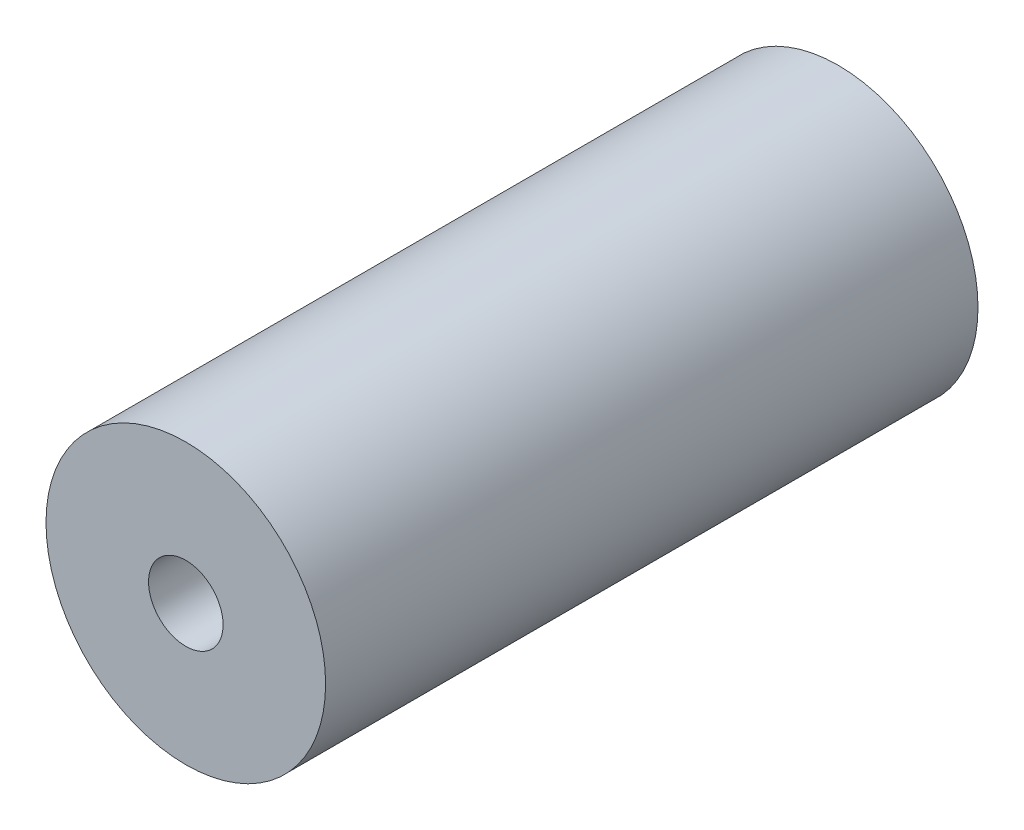
ISO-10303-21;
HEADER;
FILE_DESCRIPTION(('STEP AP214'),'2;1');
FILE_NAME('part.step','',(''),(''),'','','');
FILE_SCHEMA(('AUTOMOTIVE_DESIGN { 1 0 10303 214 1 1 1 1 }'));
ENDSEC;
DATA;
#1=APPLICATION_CONTEXT('core data for automotive mechanical design processes');
#2=APPLICATION_PROTOCOL_DEFINITION('international standard','automotive_design',2000,#1);
#3=PRODUCT_CONTEXT('',#1,'mechanical');
#4=PRODUCT('Part','Part','',(#3));
#5=PRODUCT_RELATED_PRODUCT_CATEGORY('part','',(#4));
#6=PRODUCT_DEFINITION_FORMATION('','',#4);
#7=PRODUCT_DEFINITION_CONTEXT('part definition',#1,'design');
#8=PRODUCT_DEFINITION('design','',#6,#7);
#9=PRODUCT_DEFINITION_SHAPE('','',#8);
#10=(LENGTH_UNIT() NAMED_UNIT(*) SI_UNIT(.MILLI.,.METRE.));
#11=(NAMED_UNIT(*) PLANE_ANGLE_UNIT() SI_UNIT($,.RADIAN.));
#12=(NAMED_UNIT(*) SI_UNIT($,.STERADIAN.) SOLID_ANGLE_UNIT());
#13=UNCERTAINTY_MEASURE_WITH_UNIT(LENGTH_MEASURE(1.E-05),#10,'distance_accuracy_value','');
#14=(GEOMETRIC_REPRESENTATION_CONTEXT(3) GLOBAL_UNCERTAINTY_ASSIGNED_CONTEXT((#13)) GLOBAL_UNIT_ASSIGNED_CONTEXT((#10,
#11,#12)) REPRESENTATION_CONTEXT('',''));
#15=CARTESIAN_POINT('',(0.,0.,0.));
#16=DIRECTION('',(0.,0.,1.));
#17=DIRECTION('',(1.,0.,0.));
#18=AXIS2_PLACEMENT_3D('',#15,#16,#17);
#19=CARTESIAN_POINT('',(0.,0.,14.));
#20=DIRECTION('',(0.,0.,1.));
#21=DIRECTION('',(1.,0.,0.));
#22=AXIS2_PLACEMENT_3D('',#19,#20,#21);
#23=PLANE('',#22);
#24=CARTESIAN_POINT('',(0.,0.,14.));
#25=DIRECTION('',(0.,0.,1.));
#26=DIRECTION('',(1.,0.,0.));
#27=AXIS2_PLACEMENT_3D('',#24,#25,#26);
#28=CIRCLE('',#27,3.);
#29=CARTESIAN_POINT('',(3.,0.,14.));
#30=VERTEX_POINT('',#29);
#31=EDGE_CURVE('E10',#30,#30,#28,.T.);
#32=ORIENTED_EDGE('',*,*,#31,.T.);
#33=EDGE_LOOP('',(#32));
#34=FACE_BOUND('',#33,.T.);
#35=CARTESIAN_POINT('',(0.,0.,14.));
#36=DIRECTION('',(0.,0.,1.));
#37=DIRECTION('',(1.,0.,0.));
#38=AXIS2_PLACEMENT_3D('',#35,#36,#37);
#39=CIRCLE('',#38,0.8);
#40=CARTESIAN_POINT('',(0.8,0.,14.));
#41=VERTEX_POINT('',#40);
#42=EDGE_CURVE('E41',#41,#41,#39,.T.);
#43=ORIENTED_EDGE('',*,*,#42,.F.);
#44=EDGE_LOOP('',(#43));
#45=FACE_BOUND('',#44,.T.);
#46=ADVANCED_FACE('F30',(#34,#45),#23,.T.);
#47=CARTESIAN_POINT('',(0.,0.,0.));
#48=DIRECTION('',(0.,0.,1.));
#49=DIRECTION('',(1.,0.,0.));
#50=AXIS2_PLACEMENT_3D('',#47,#48,#49);
#51=PLANE('',#50);
#52=CARTESIAN_POINT('',(0.,0.,0.));
#53=DIRECTION('',(0.,0.,1.));
#54=DIRECTION('',(1.,0.,0.));
#55=AXIS2_PLACEMENT_3D('',#52,#53,#54);
#56=CIRCLE('',#55,3.);
#57=CARTESIAN_POINT('',(3.,0.,0.));
#58=VERTEX_POINT('',#57);
#59=EDGE_CURVE('E34',#58,#58,#56,.T.);
#60=ORIENTED_EDGE('',*,*,#59,.F.);
#61=EDGE_LOOP('',(#60));
#62=FACE_BOUND('',#61,.T.);
#63=CARTESIAN_POINT('',(0.,0.,0.));
#64=DIRECTION('',(0.,0.,1.));
#65=DIRECTION('',(1.,0.,0.));
#66=AXIS2_PLACEMENT_3D('',#63,#64,#65);
#67=CIRCLE('',#66,0.8);
#68=CARTESIAN_POINT('',(0.8,0.,0.));
#69=VERTEX_POINT('',#68);
#70=EDGE_CURVE('E43',#69,#69,#67,.T.);
#71=ORIENTED_EDGE('',*,*,#70,.T.);
#72=EDGE_LOOP('',(#71));
#73=FACE_BOUND('',#72,.T.);
#74=ADVANCED_FACE('F53',(#62,#73),#51,.F.);
#75=CARTESIAN_POINT('',(0.,0.,14.));
#76=DIRECTION('',(0.,0.,-1.));
#77=DIRECTION('',(-1.,0.,0.));
#78=AXIS2_PLACEMENT_3D('',#75,#76,#77);
#79=CYLINDRICAL_SURFACE('',#78,3.);
#80=ORIENTED_EDGE('',*,*,#31,.F.);
#81=EDGE_LOOP('',(#80));
#82=FACE_BOUND('',#81,.T.);
#83=ORIENTED_EDGE('',*,*,#59,.T.);
#84=EDGE_LOOP('',(#83));
#85=FACE_BOUND('',#84,.T.);
#86=ADVANCED_FACE('F32',(#82,#85),#79,.T.);
#87=CARTESIAN_POINT('',(0.,0.,14.));
#88=DIRECTION('',(0.,0.,-1.));
#89=DIRECTION('',(-1.,0.,0.));
#90=AXIS2_PLACEMENT_3D('',#87,#88,#89);
#91=CYLINDRICAL_SURFACE('',#90,0.8);
#92=ORIENTED_EDGE('',*,*,#42,.T.);
#93=EDGE_LOOP('',(#92));
#94=FACE_BOUND('',#93,.T.);
#95=ORIENTED_EDGE('',*,*,#70,.F.);
#96=EDGE_LOOP('',(#95));
#97=FACE_BOUND('',#96,.T.);
#98=ADVANCED_FACE('F49',(#94,#97),#91,.F.);
#99=CLOSED_SHELL('',(#46,#74,#86,#98));
#100=MANIFOLD_SOLID_BREP('B2',#99);
#101=ADVANCED_BREP_SHAPE_REPRESENTATION('',(#18,#100),#14);
#102=SHAPE_DEFINITION_REPRESENTATION(#9,#101);
ENDSEC;
END-ISO-10303-21;
